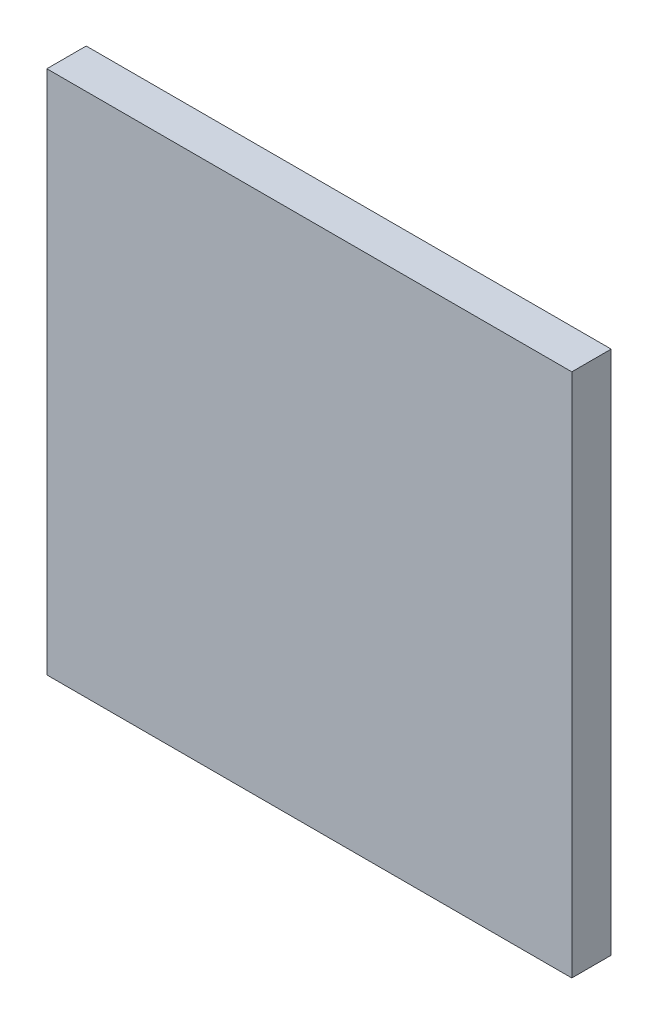
ISO-10303-21;
HEADER;
FILE_DESCRIPTION(('STEP AP214'),'2;1');
FILE_NAME('part.step','',(''),(''),'','','');
FILE_SCHEMA(('AUTOMOTIVE_DESIGN { 1 0 10303 214 1 1 1 1 }'));
ENDSEC;
DATA;
#1=APPLICATION_CONTEXT('core data for automotive mechanical design processes');
#2=APPLICATION_PROTOCOL_DEFINITION('international standard','automotive_design',2000,#1);
#3=PRODUCT_CONTEXT('',#1,'mechanical');
#4=PRODUCT('Part','Part','',(#3));
#5=PRODUCT_RELATED_PRODUCT_CATEGORY('part','',(#4));
#6=PRODUCT_DEFINITION_FORMATION('','',#4);
#7=PRODUCT_DEFINITION_CONTEXT('part definition',#1,'design');
#8=PRODUCT_DEFINITION('design','',#6,#7);
#9=PRODUCT_DEFINITION_SHAPE('','',#8);
#10=(LENGTH_UNIT() NAMED_UNIT(*) SI_UNIT(.MILLI.,.METRE.));
#11=(NAMED_UNIT(*) PLANE_ANGLE_UNIT() SI_UNIT($,.RADIAN.));
#12=(NAMED_UNIT(*) SI_UNIT($,.STERADIAN.) SOLID_ANGLE_UNIT());
#13=UNCERTAINTY_MEASURE_WITH_UNIT(LENGTH_MEASURE(1.E-05),#10,'distance_accuracy_value','');
#14=(GEOMETRIC_REPRESENTATION_CONTEXT(3) GLOBAL_UNCERTAINTY_ASSIGNED_CONTEXT((#13)) GLOBAL_UNIT_ASSIGNED_CONTEXT((#10,
#11,#12)) REPRESENTATION_CONTEXT('',''));
#15=CARTESIAN_POINT('',(0.,0.,0.));
#16=DIRECTION('',(0.,0.,1.));
#17=DIRECTION('',(1.,0.,0.));
#18=AXIS2_PLACEMENT_3D('',#15,#16,#17);
#19=CARTESIAN_POINT('',(-0.2,0.2,0.03));
#20=DIRECTION('',(1.,0.,0.));
#21=DIRECTION('',(0.,0.,-1.));
#22=AXIS2_PLACEMENT_3D('',#19,#20,#21);
#23=PLANE('',#22);
#24=DIRECTION('',(0.,-1.,0.));
#25=VECTOR('',#24,1.);
#26=CARTESIAN_POINT('',(-0.2,0.2,0.));
#27=LINE('',#26,#25);
#28=CARTESIAN_POINT('',(-0.2,0.2,0.));
#29=VERTEX_POINT('',#28);
#30=CARTESIAN_POINT('',(-0.2,-0.2,0.));
#31=VERTEX_POINT('',#30);
#32=EDGE_CURVE('E97',#29,#31,#27,.T.);
#33=ORIENTED_EDGE('',*,*,#32,.T.);
#34=DIRECTION('',(0.,0.,-1.));
#35=VECTOR('',#34,1.);
#36=CARTESIAN_POINT('',(-0.2,-0.2,0.03));
#37=LINE('',#36,#35);
#38=CARTESIAN_POINT('',(-0.2,-0.2,0.03));
#39=VERTEX_POINT('',#38);
#40=EDGE_CURVE('E11',#39,#31,#37,.T.);
#41=ORIENTED_EDGE('',*,*,#40,.F.);
#42=DIRECTION('',(0.,-1.,0.));
#43=VECTOR('',#42,1.);
#44=CARTESIAN_POINT('',(-0.2,0.2,0.03));
#45=LINE('',#44,#43);
#46=CARTESIAN_POINT('',(-0.2,0.2,0.03));
#47=VERTEX_POINT('',#46);
#48=EDGE_CURVE('E85',#47,#39,#45,.T.);
#49=ORIENTED_EDGE('',*,*,#48,.F.);
#50=DIRECTION('',(0.,0.,-1.));
#51=VECTOR('',#50,1.);
#52=CARTESIAN_POINT('',(-0.2,0.2,0.03));
#53=LINE('',#52,#51);
#54=EDGE_CURVE('E93',#47,#29,#53,.T.);
#55=ORIENTED_EDGE('',*,*,#54,.T.);
#56=EDGE_LOOP('',(#33,#41,#49,#55));
#57=FACE_BOUND('',#56,.T.);
#58=ADVANCED_FACE('F34',(#57),#23,.F.);
#59=CARTESIAN_POINT('',(-0.2,-0.2,0.03));
#60=DIRECTION('',(0.,1.,0.));
#61=DIRECTION('',(0.,0.,1.));
#62=AXIS2_PLACEMENT_3D('',#59,#60,#61);
#63=PLANE('',#62);
#64=DIRECTION('',(1.,0.,0.));
#65=VECTOR('',#64,1.);
#66=CARTESIAN_POINT('',(-0.2,-0.2,0.));
#67=LINE('',#66,#65);
#68=CARTESIAN_POINT('',(0.2,-0.2,0.));
#69=VERTEX_POINT('',#68);
#70=EDGE_CURVE('E89',#31,#69,#67,.T.);
#71=ORIENTED_EDGE('',*,*,#70,.T.);
#72=DIRECTION('',(0.,0.,-1.));
#73=VECTOR('',#72,1.);
#74=CARTESIAN_POINT('',(0.2,-0.2,0.03));
#75=LINE('',#74,#73);
#76=CARTESIAN_POINT('',(0.2,-0.2,0.03));
#77=VERTEX_POINT('',#76);
#78=EDGE_CURVE('E42',#77,#69,#75,.T.);
#79=ORIENTED_EDGE('',*,*,#78,.F.);
#80=DIRECTION('',(1.,0.,0.));
#81=VECTOR('',#80,1.);
#82=CARTESIAN_POINT('',(-0.2,-0.2,0.03));
#83=LINE('',#82,#81);
#84=EDGE_CURVE('E80',#39,#77,#83,.T.);
#85=ORIENTED_EDGE('',*,*,#84,.F.);
#86=ORIENTED_EDGE('',*,*,#40,.T.);
#87=EDGE_LOOP('',(#71,#79,#85,#86));
#88=FACE_BOUND('',#87,.T.);
#89=ADVANCED_FACE('F88',(#88),#63,.F.);
#90=CARTESIAN_POINT('',(0.2,-0.2,0.03));
#91=DIRECTION('',(-1.,0.,0.));
#92=DIRECTION('',(0.,0.,1.));
#93=AXIS2_PLACEMENT_3D('',#90,#91,#92);
#94=PLANE('',#93);
#95=DIRECTION('',(0.,1.,0.));
#96=VECTOR('',#95,1.);
#97=CARTESIAN_POINT('',(0.2,-0.2,0.));
#98=LINE('',#97,#96);
#99=CARTESIAN_POINT('',(0.2,0.2,0.));
#100=VERTEX_POINT('',#99);
#101=EDGE_CURVE('E67',#69,#100,#98,.T.);
#102=ORIENTED_EDGE('',*,*,#101,.T.);
#103=DIRECTION('',(0.,0.,-1.));
#104=VECTOR('',#103,1.);
#105=CARTESIAN_POINT('',(0.2,0.2,0.03));
#106=LINE('',#105,#104);
#107=CARTESIAN_POINT('',(0.2,0.2,0.03));
#108=VERTEX_POINT('',#107);
#109=EDGE_CURVE('E90',#108,#100,#106,.T.);
#110=ORIENTED_EDGE('',*,*,#109,.F.);
#111=DIRECTION('',(0.,1.,0.));
#112=VECTOR('',#111,1.);
#113=CARTESIAN_POINT('',(0.2,-0.2,0.03));
#114=LINE('',#113,#112);
#115=EDGE_CURVE('E83',#77,#108,#114,.T.);
#116=ORIENTED_EDGE('',*,*,#115,.F.);
#117=ORIENTED_EDGE('',*,*,#78,.T.);
#118=EDGE_LOOP('',(#102,#110,#116,#117));
#119=FACE_BOUND('',#118,.T.);
#120=ADVANCED_FACE('F91',(#119),#94,.F.);
#121=CARTESIAN_POINT('',(0.2,0.2,0.03));
#122=DIRECTION('',(0.,-1.,0.));
#123=DIRECTION('',(0.,0.,-1.));
#124=AXIS2_PLACEMENT_3D('',#121,#122,#123);
#125=PLANE('',#124);
#126=DIRECTION('',(-1.,0.,0.));
#127=VECTOR('',#126,1.);
#128=CARTESIAN_POINT('',(0.2,0.2,0.));
#129=LINE('',#128,#127);
#130=EDGE_CURVE('E73',#100,#29,#129,.T.);
#131=ORIENTED_EDGE('',*,*,#130,.T.);
#132=ORIENTED_EDGE('',*,*,#54,.F.);
#133=DIRECTION('',(-1.,0.,0.));
#134=VECTOR('',#133,1.);
#135=CARTESIAN_POINT('',(0.2,0.2,0.03));
#136=LINE('',#135,#134);
#137=EDGE_CURVE('E50',#108,#47,#136,.T.);
#138=ORIENTED_EDGE('',*,*,#137,.F.);
#139=ORIENTED_EDGE('',*,*,#109,.T.);
#140=EDGE_LOOP('',(#131,#132,#138,#139));
#141=FACE_BOUND('',#140,.T.);
#142=ADVANCED_FACE('F104',(#141),#125,.F.);
#143=CARTESIAN_POINT('',(0.,0.,0.03));
#144=DIRECTION('',(0.,0.,1.));
#145=DIRECTION('',(1.,0.,0.));
#146=AXIS2_PLACEMENT_3D('',#143,#144,#145);
#147=PLANE('',#146);
#148=ORIENTED_EDGE('',*,*,#48,.T.);
#149=ORIENTED_EDGE('',*,*,#84,.T.);
#150=ORIENTED_EDGE('',*,*,#115,.T.);
#151=ORIENTED_EDGE('',*,*,#137,.T.);
#152=EDGE_LOOP('',(#148,#149,#150,#151));
#153=FACE_BOUND('',#152,.T.);
#154=ADVANCED_FACE('F81',(#153),#147,.T.);
#155=CARTESIAN_POINT('',(0.,0.,0.));
#156=DIRECTION('',(0.,0.,1.));
#157=DIRECTION('',(1.,0.,0.));
#158=AXIS2_PLACEMENT_3D('',#155,#156,#157);
#159=PLANE('',#158);
#160=ORIENTED_EDGE('',*,*,#32,.F.);
#161=ORIENTED_EDGE('',*,*,#130,.F.);
#162=ORIENTED_EDGE('',*,*,#101,.F.);
#163=ORIENTED_EDGE('',*,*,#70,.F.);
#164=EDGE_LOOP('',(#160,#161,#162,#163));
#165=FACE_BOUND('',#164,.T.);
#166=ADVANCED_FACE('F107',(#165),#159,.F.);
#167=CLOSED_SHELL('',(#58,#89,#120,#142,#154,#166));
#168=MANIFOLD_SOLID_BREP('B2',#167);
#169=ADVANCED_BREP_SHAPE_REPRESENTATION('',(#18,#168),#14);
#170=SHAPE_DEFINITION_REPRESENTATION(#9,#169);
ENDSEC;
END-ISO-10303-21;
